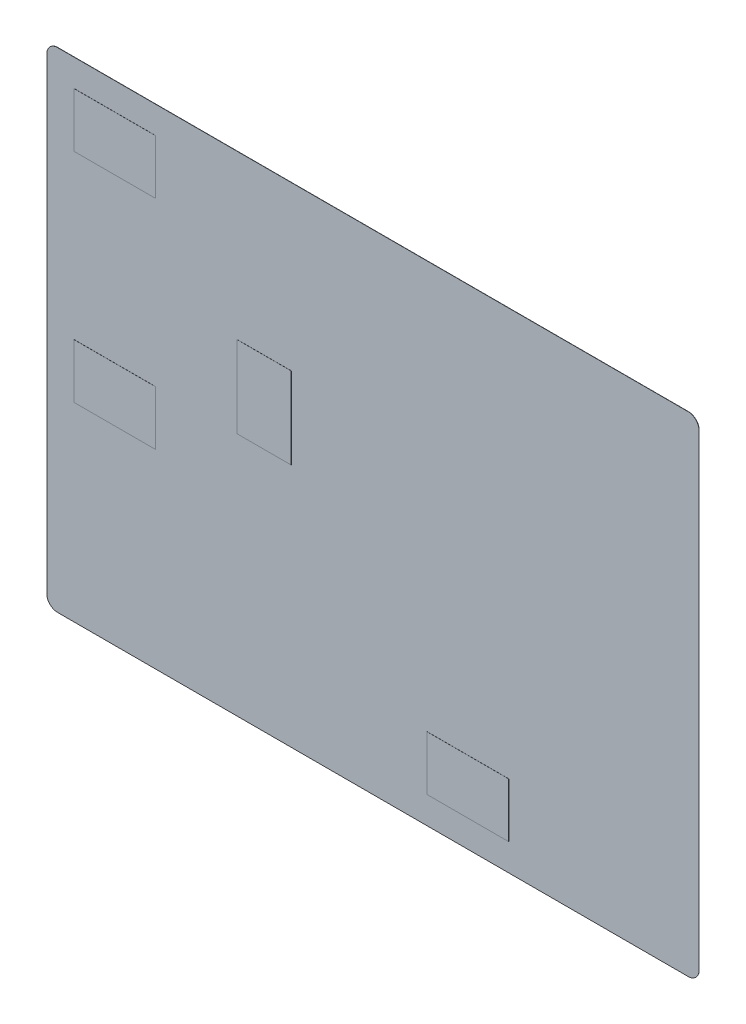
ISO-10303-21;
HEADER;
FILE_DESCRIPTION(('STEP AP214'),'2;1');
FILE_NAME('part.step','',(''),(''),'','','');
FILE_SCHEMA(('AUTOMOTIVE_DESIGN { 1 0 10303 214 1 1 1 1 }'));
ENDSEC;
DATA;
#1=APPLICATION_CONTEXT('core data for automotive mechanical design processes');
#2=APPLICATION_PROTOCOL_DEFINITION('international standard','automotive_design',2000,#1);
#3=PRODUCT_CONTEXT('',#1,'mechanical');
#4=PRODUCT('Part','Part','',(#3));
#5=PRODUCT_RELATED_PRODUCT_CATEGORY('part','',(#4));
#6=PRODUCT_DEFINITION_FORMATION('','',#4);
#7=PRODUCT_DEFINITION_CONTEXT('part definition',#1,'design');
#8=PRODUCT_DEFINITION('design','',#6,#7);
#9=PRODUCT_DEFINITION_SHAPE('','',#8);
#10=(LENGTH_UNIT() NAMED_UNIT(*) SI_UNIT(.MILLI.,.METRE.));
#11=(NAMED_UNIT(*) PLANE_ANGLE_UNIT() SI_UNIT($,.RADIAN.));
#12=(NAMED_UNIT(*) SI_UNIT($,.STERADIAN.) SOLID_ANGLE_UNIT());
#13=UNCERTAINTY_MEASURE_WITH_UNIT(LENGTH_MEASURE(1.E-05),#10,'distance_accuracy_value','');
#14=(GEOMETRIC_REPRESENTATION_CONTEXT(3) GLOBAL_UNCERTAINTY_ASSIGNED_CONTEXT((#13)) GLOBAL_UNIT_ASSIGNED_CONTEXT((#10,
#11,#12)) REPRESENTATION_CONTEXT('',''));
#15=CARTESIAN_POINT('',(0.,0.,0.));
#16=DIRECTION('',(0.,0.,1.));
#17=DIRECTION('',(1.,0.,0.));
#18=AXIS2_PLACEMENT_3D('',#15,#16,#17);
#19=CARTESIAN_POINT('',(0.,0.,0.));
#20=DIRECTION('',(0.,0.,1.));
#21=DIRECTION('',(1.,0.,0.));
#22=AXIS2_PLACEMENT_3D('',#19,#20,#21);
#23=PLANE('',#22);
#24=DIRECTION('',(0.,-1.,0.));
#25=VECTOR('',#24,1.);
#26=CARTESIAN_POINT('',(-2000.,2000.,0.));
#27=LINE('',#26,#25);
#28=CARTESIAN_POINT('',(-2000.,2000.,0.));
#29=VERTEX_POINT('',#28);
#30=CARTESIAN_POINT('',(-2000.,1500.,0.));
#31=VERTEX_POINT('',#30);
#32=EDGE_CURVE('E129',#29,#31,#27,.T.);
#33=ORIENTED_EDGE('',*,*,#32,.F.);
#34=DIRECTION('',(-1.,0.,0.));
#35=VECTOR('',#34,1.);
#36=CARTESIAN_POINT('',(-1250.,2000.,0.));
#37=LINE('',#36,#35);
#38=CARTESIAN_POINT('',(-1250.,2000.,0.));
#39=VERTEX_POINT('',#38);
#40=EDGE_CURVE('E75',#39,#29,#37,.T.);
#41=ORIENTED_EDGE('',*,*,#40,.F.);
#42=DIRECTION('',(0.,1.,0.));
#43=VECTOR('',#42,1.);
#44=CARTESIAN_POINT('',(-1250.,1500.,0.));
#45=LINE('',#44,#43);
#46=CARTESIAN_POINT('',(-1250.,1500.,0.));
#47=VERTEX_POINT('',#46);
#48=EDGE_CURVE('E152',#47,#39,#45,.T.);
#49=ORIENTED_EDGE('',*,*,#48,.F.);
#50=DIRECTION('',(1.,0.,0.));
#51=VECTOR('',#50,1.);
#52=CARTESIAN_POINT('',(-2000.,1500.,0.));
#53=LINE('',#52,#51);
#54=EDGE_CURVE('E133',#31,#47,#53,.T.);
#55=ORIENTED_EDGE('',*,*,#54,.F.);
#56=EDGE_LOOP('',(#33,#41,#49,#55));
#57=FACE_BOUND('',#56,.T.);
#58=ADVANCED_FACE('F66',(#57),#23,.F.);
#59=CARTESIAN_POINT('',(0.,0.,1.));
#60=DIRECTION('',(0.,0.,1.));
#61=DIRECTION('',(1.,0.,0.));
#62=AXIS2_PLACEMENT_3D('',#59,#60,#61);
#63=PLANE('',#62);
#64=DIRECTION('',(0.,-1.,0.));
#65=VECTOR('',#64,1.);
#66=CARTESIAN_POINT('',(-2000.,2000.,1.));
#67=LINE('',#66,#65);
#68=CARTESIAN_POINT('',(-2000.,2000.,1.));
#69=VERTEX_POINT('',#68);
#70=CARTESIAN_POINT('',(-2000.,1500.,1.));
#71=VERTEX_POINT('',#70);
#72=EDGE_CURVE('E131',#69,#71,#67,.T.);
#73=ORIENTED_EDGE('',*,*,#72,.T.);
#74=DIRECTION('',(1.,0.,0.));
#75=VECTOR('',#74,1.);
#76=CARTESIAN_POINT('',(-2000.,1500.,1.));
#77=LINE('',#76,#75);
#78=CARTESIAN_POINT('',(-1250.,1500.,1.));
#79=VERTEX_POINT('',#78);
#80=EDGE_CURVE('E145',#71,#79,#77,.T.);
#81=ORIENTED_EDGE('',*,*,#80,.T.);
#82=DIRECTION('',(0.,1.,0.));
#83=VECTOR('',#82,1.);
#84=CARTESIAN_POINT('',(-1250.,1500.,1.));
#85=LINE('',#84,#83);
#86=CARTESIAN_POINT('',(-1250.,2000.,1.));
#87=VERTEX_POINT('',#86);
#88=EDGE_CURVE('E123',#79,#87,#85,.T.);
#89=ORIENTED_EDGE('',*,*,#88,.T.);
#90=DIRECTION('',(-1.,0.,0.));
#91=VECTOR('',#90,1.);
#92=CARTESIAN_POINT('',(-1250.,2000.,1.));
#93=LINE('',#92,#91);
#94=EDGE_CURVE('E12',#87,#69,#93,.T.);
#95=ORIENTED_EDGE('',*,*,#94,.T.);
#96=EDGE_LOOP('',(#73,#81,#89,#95));
#97=FACE_BOUND('',#96,.T.);
#98=ADVANCED_FACE('F68',(#97),#63,.T.);
#99=CARTESIAN_POINT('',(-1250.,2000.,1.));
#100=DIRECTION('',(0.,-1.,0.));
#101=DIRECTION('',(0.,0.,-1.));
#102=AXIS2_PLACEMENT_3D('',#99,#100,#101);
#103=PLANE('',#102);
#104=ORIENTED_EDGE('',*,*,#40,.T.);
#105=DIRECTION('',(0.,0.,-1.));
#106=VECTOR('',#105,1.);
#107=CARTESIAN_POINT('',(-2000.,2000.,1.));
#108=LINE('',#107,#106);
#109=EDGE_CURVE('E117',#69,#29,#108,.T.);
#110=ORIENTED_EDGE('',*,*,#109,.F.);
#111=ORIENTED_EDGE('',*,*,#94,.F.);
#112=DIRECTION('',(0.,0.,-1.));
#113=VECTOR('',#112,1.);
#114=CARTESIAN_POINT('',(-1250.,2000.,1.));
#115=LINE('',#114,#113);
#116=EDGE_CURVE('E120',#87,#39,#115,.T.);
#117=ORIENTED_EDGE('',*,*,#116,.T.);
#118=EDGE_LOOP('',(#104,#110,#111,#117));
#119=FACE_BOUND('',#118,.T.);
#120=ADVANCED_FACE('F116',(#119),#103,.F.);
#121=CARTESIAN_POINT('',(-1250.,1500.,1.));
#122=DIRECTION('',(-1.,0.,0.));
#123=DIRECTION('',(0.,1.,0.));
#124=AXIS2_PLACEMENT_3D('',#121,#122,#123);
#125=PLANE('',#124);
#126=ORIENTED_EDGE('',*,*,#48,.T.);
#127=ORIENTED_EDGE('',*,*,#116,.F.);
#128=ORIENTED_EDGE('',*,*,#88,.F.);
#129=DIRECTION('',(0.,0.,-1.));
#130=VECTOR('',#129,1.);
#131=CARTESIAN_POINT('',(-1250.,1500.,1.));
#132=LINE('',#131,#130);
#133=EDGE_CURVE('E156',#79,#47,#132,.T.);
#134=ORIENTED_EDGE('',*,*,#133,.T.);
#135=EDGE_LOOP('',(#126,#127,#128,#134));
#136=FACE_BOUND('',#135,.T.);
#137=ADVANCED_FACE('F167',(#136),#125,.F.);
#138=CARTESIAN_POINT('',(-2000.,1500.,1.));
#139=DIRECTION('',(0.,1.,0.));
#140=DIRECTION('',(1.,0.,0.));
#141=AXIS2_PLACEMENT_3D('',#138,#139,#140);
#142=PLANE('',#141);
#143=ORIENTED_EDGE('',*,*,#54,.T.);
#144=ORIENTED_EDGE('',*,*,#133,.F.);
#145=ORIENTED_EDGE('',*,*,#80,.F.);
#146=DIRECTION('',(0.,0.,-1.));
#147=VECTOR('',#146,1.);
#148=CARTESIAN_POINT('',(-2000.,1500.,1.));
#149=LINE('',#148,#147);
#150=EDGE_CURVE('E138',#71,#31,#149,.T.);
#151=ORIENTED_EDGE('',*,*,#150,.T.);
#152=EDGE_LOOP('',(#143,#144,#145,#151));
#153=FACE_BOUND('',#152,.T.);
#154=ADVANCED_FACE('F169',(#153),#142,.F.);
#155=CARTESIAN_POINT('',(-2000.,2000.,1.));
#156=DIRECTION('',(1.,0.,0.));
#157=DIRECTION('',(0.,1.,0.));
#158=AXIS2_PLACEMENT_3D('',#155,#156,#157);
#159=PLANE('',#158);
#160=ORIENTED_EDGE('',*,*,#32,.T.);
#161=ORIENTED_EDGE('',*,*,#150,.F.);
#162=ORIENTED_EDGE('',*,*,#72,.F.);
#163=ORIENTED_EDGE('',*,*,#109,.T.);
#164=EDGE_LOOP('',(#160,#161,#162,#163));
#165=FACE_BOUND('',#164,.T.);
#166=ADVANCED_FACE('F127',(#165),#159,.F.);
#167=CLOSED_SHELL('',(#58,#98,#120,#137,#154,#166));
#168=MANIFOLD_SOLID_BREP('B2',#167);
#169=CARTESIAN_POINT('',(0.,0.,0.));
#170=DIRECTION('',(0.,0.,1.));
#171=DIRECTION('',(1.,0.,0.));
#172=AXIS2_PLACEMENT_3D('',#169,#170,#171);
#173=PLANE('',#172);
#174=DIRECTION('',(0.,-1.,0.));
#175=VECTOR('',#174,1.);
#176=CARTESIAN_POINT('',(-2000.,0.,0.));
#177=LINE('',#176,#175);
#178=CARTESIAN_POINT('',(-2000.,0.,0.));
#179=VERTEX_POINT('',#178);
#180=CARTESIAN_POINT('',(-2000.,-500.,0.));
#181=VERTEX_POINT('',#180);
#182=EDGE_CURVE('E363',#179,#181,#177,.T.);
#183=ORIENTED_EDGE('',*,*,#182,.F.);
#184=DIRECTION('',(-1.,0.,0.));
#185=VECTOR('',#184,1.);
#186=CARTESIAN_POINT('',(-1250.,0.,0.));
#187=LINE('',#186,#185);
#188=CARTESIAN_POINT('',(-1250.,0.,0.));
#189=VERTEX_POINT('',#188);
#190=EDGE_CURVE('E290',#189,#179,#187,.T.);
#191=ORIENTED_EDGE('',*,*,#190,.F.);
#192=DIRECTION('',(0.,1.,0.));
#193=VECTOR('',#192,1.);
#194=CARTESIAN_POINT('',(-1250.,-500.,0.));
#195=LINE('',#194,#193);
#196=CARTESIAN_POINT('',(-1250.,-500.,0.));
#197=VERTEX_POINT('',#196);
#198=EDGE_CURVE('E337',#197,#189,#195,.T.);
#199=ORIENTED_EDGE('',*,*,#198,.F.);
#200=DIRECTION('',(1.,0.,0.));
#201=VECTOR('',#200,1.);
#202=CARTESIAN_POINT('',(-2000.,-500.,0.));
#203=LINE('',#202,#201);
#204=EDGE_CURVE('E341',#181,#197,#203,.T.);
#205=ORIENTED_EDGE('',*,*,#204,.F.);
#206=EDGE_LOOP('',(#183,#191,#199,#205));
#207=FACE_BOUND('',#206,.T.);
#208=ADVANCED_FACE('F280',(#207),#173,.F.);
#209=CARTESIAN_POINT('',(0.,0.,1.));
#210=DIRECTION('',(0.,0.,1.));
#211=DIRECTION('',(1.,0.,0.));
#212=AXIS2_PLACEMENT_3D('',#209,#210,#211);
#213=PLANE('',#212);
#214=DIRECTION('',(0.,-1.,0.));
#215=VECTOR('',#214,1.);
#216=CARTESIAN_POINT('',(-2000.,0.,1.));
#217=LINE('',#216,#215);
#218=CARTESIAN_POINT('',(-2000.,0.,1.));
#219=VERTEX_POINT('',#218);
#220=CARTESIAN_POINT('',(-2000.,-500.,1.));
#221=VERTEX_POINT('',#220);
#222=EDGE_CURVE('E332',#219,#221,#217,.T.);
#223=ORIENTED_EDGE('',*,*,#222,.T.);
#224=DIRECTION('',(1.,0.,0.));
#225=VECTOR('',#224,1.);
#226=CARTESIAN_POINT('',(-2000.,-500.,1.));
#227=LINE('',#226,#225);
#228=CARTESIAN_POINT('',(-1250.,-500.,1.));
#229=VERTEX_POINT('',#228);
#230=EDGE_CURVE('E328',#221,#229,#227,.T.);
#231=ORIENTED_EDGE('',*,*,#230,.T.);
#232=DIRECTION('',(0.,1.,0.));
#233=VECTOR('',#232,1.);
#234=CARTESIAN_POINT('',(-1250.,-500.,1.));
#235=LINE('',#234,#233);
#236=CARTESIAN_POINT('',(-1250.,0.,1.));
#237=VERTEX_POINT('',#236);
#238=EDGE_CURVE('E283',#229,#237,#235,.T.);
#239=ORIENTED_EDGE('',*,*,#238,.T.);
#240=DIRECTION('',(-1.,0.,0.));
#241=VECTOR('',#240,1.);
#242=CARTESIAN_POINT('',(-1250.,0.,1.));
#243=LINE('',#242,#241);
#244=EDGE_CURVE('E64',#237,#219,#243,.T.);
#245=ORIENTED_EDGE('',*,*,#244,.T.);
#246=EDGE_LOOP('',(#223,#231,#239,#245));
#247=FACE_BOUND('',#246,.T.);
#248=ADVANCED_FACE('F329',(#247),#213,.T.);
#249=CARTESIAN_POINT('',(-1250.,0.,1.));
#250=DIRECTION('',(0.,-1.,0.));
#251=DIRECTION('',(0.,0.,-1.));
#252=AXIS2_PLACEMENT_3D('',#249,#250,#251);
#253=PLANE('',#252);
#254=ORIENTED_EDGE('',*,*,#190,.T.);
#255=DIRECTION('',(0.,0.,-1.));
#256=VECTOR('',#255,1.);
#257=CARTESIAN_POINT('',(-2000.,0.,1.));
#258=LINE('',#257,#256);
#259=EDGE_CURVE('E346',#219,#179,#258,.T.);
#260=ORIENTED_EDGE('',*,*,#259,.F.);
#261=ORIENTED_EDGE('',*,*,#244,.F.);
#262=DIRECTION('',(0.,0.,-1.));
#263=VECTOR('',#262,1.);
#264=CARTESIAN_POINT('',(-1250.,0.,1.));
#265=LINE('',#264,#263);
#266=EDGE_CURVE('E323',#237,#189,#265,.T.);
#267=ORIENTED_EDGE('',*,*,#266,.T.);
#268=EDGE_LOOP('',(#254,#260,#261,#267));
#269=FACE_BOUND('',#268,.T.);
#270=ADVANCED_FACE('F354',(#269),#253,.F.);
#271=CARTESIAN_POINT('',(-1250.,-500.,1.));
#272=DIRECTION('',(-1.,0.,0.));
#273=DIRECTION('',(0.,0.,1.));
#274=AXIS2_PLACEMENT_3D('',#271,#272,#273);
#275=PLANE('',#274);
#276=ORIENTED_EDGE('',*,*,#198,.T.);
#277=ORIENTED_EDGE('',*,*,#266,.F.);
#278=ORIENTED_EDGE('',*,*,#238,.F.);
#279=DIRECTION('',(0.,0.,-1.));
#280=VECTOR('',#279,1.);
#281=CARTESIAN_POINT('',(-1250.,-500.,1.));
#282=LINE('',#281,#280);
#283=EDGE_CURVE('E321',#229,#197,#282,.T.);
#284=ORIENTED_EDGE('',*,*,#283,.T.);
#285=EDGE_LOOP('',(#276,#277,#278,#284));
#286=FACE_BOUND('',#285,.T.);
#287=ADVANCED_FACE('F319',(#286),#275,.F.);
#288=CARTESIAN_POINT('',(-2000.,-500.,1.));
#289=DIRECTION('',(0.,1.,0.));
#290=DIRECTION('',(1.,0.,0.));
#291=AXIS2_PLACEMENT_3D('',#288,#289,#290);
#292=PLANE('',#291);
#293=ORIENTED_EDGE('',*,*,#204,.T.);
#294=ORIENTED_EDGE('',*,*,#283,.F.);
#295=ORIENTED_EDGE('',*,*,#230,.F.);
#296=DIRECTION('',(0.,0.,-1.));
#297=VECTOR('',#296,1.);
#298=CARTESIAN_POINT('',(-2000.,-500.,1.));
#299=LINE('',#298,#297);
#300=EDGE_CURVE('E366',#221,#181,#299,.T.);
#301=ORIENTED_EDGE('',*,*,#300,.T.);
#302=EDGE_LOOP('',(#293,#294,#295,#301));
#303=FACE_BOUND('',#302,.T.);
#304=ADVANCED_FACE('F339',(#303),#292,.F.);
#305=CARTESIAN_POINT('',(-2000.,0.,1.));
#306=DIRECTION('',(1.,0.,0.));
#307=DIRECTION('',(0.,-1.,0.));
#308=AXIS2_PLACEMENT_3D('',#305,#306,#307);
#309=PLANE('',#308);
#310=ORIENTED_EDGE('',*,*,#182,.T.);
#311=ORIENTED_EDGE('',*,*,#300,.F.);
#312=ORIENTED_EDGE('',*,*,#222,.F.);
#313=ORIENTED_EDGE('',*,*,#259,.T.);
#314=EDGE_LOOP('',(#310,#311,#312,#313));
#315=FACE_BOUND('',#314,.T.);
#316=ADVANCED_FACE('F362',(#315),#309,.F.);
#317=CLOSED_SHELL('',(#208,#248,#270,#287,#304,#316));
#318=MANIFOLD_SOLID_BREP('B6',#317);
#319=CARTESIAN_POINT('',(0.,0.,0.));
#320=DIRECTION('',(0.,0.,1.));
#321=DIRECTION('',(1.,0.,0.));
#322=AXIS2_PLACEMENT_3D('',#319,#320,#321);
#323=PLANE('',#322);
#324=DIRECTION('',(0.,-1.,0.));
#325=VECTOR('',#324,1.);
#326=CARTESIAN_POINT('',(-500.,750.,0.));
#327=LINE('',#326,#325);
#328=CARTESIAN_POINT('',(-500.,750.,0.));
#329=VERTEX_POINT('',#328);
#330=CARTESIAN_POINT('',(-500.,-1.66533453693773E-12,0.));
#331=VERTEX_POINT('',#330);
#332=EDGE_CURVE('E568',#329,#331,#327,.T.);
#333=ORIENTED_EDGE('',*,*,#332,.F.);
#334=DIRECTION('',(-1.,0.,0.));
#335=VECTOR('',#334,1.);
#336=CARTESIAN_POINT('',(4.54747350886464E-13,750.,0.));
#337=LINE('',#336,#335);
#338=CARTESIAN_POINT('',(4.54747350886464E-13,750.,0.));
#339=VERTEX_POINT('',#338);
#340=EDGE_CURVE('E502',#339,#329,#337,.T.);
#341=ORIENTED_EDGE('',*,*,#340,.F.);
#342=DIRECTION('',(0.,1.,0.));
#343=VECTOR('',#342,1.);
#344=CARTESIAN_POINT('',(1.56319401867222E-12,-1.13686837721616E-12,0.));
#345=LINE('',#344,#343);
#346=CARTESIAN_POINT('',(1.55431223447522E-12,-1.08585914020123E-12,0.));
#347=VERTEX_POINT('',#346);
#348=EDGE_CURVE('E557',#347,#339,#345,.T.);
#349=ORIENTED_EDGE('',*,*,#348,.F.);
#350=DIRECTION('',(1.,0.,0.));
#351=VECTOR('',#350,1.);
#352=CARTESIAN_POINT('',(-500.,-1.67688085639384E-12,0.));
#353=LINE('',#352,#351);
#354=EDGE_CURVE('E578',#331,#347,#353,.T.);
#355=ORIENTED_EDGE('',*,*,#354,.F.);
#356=EDGE_LOOP('',(#333,#341,#349,#355));
#357=FACE_BOUND('',#356,.T.);
#358=ADVANCED_FACE('F494',(#357),#323,.F.);
#359=CARTESIAN_POINT('',(0.,0.,1.));
#360=DIRECTION('',(0.,0.,1.));
#361=DIRECTION('',(1.,0.,0.));
#362=AXIS2_PLACEMENT_3D('',#359,#360,#361);
#363=PLANE('',#362);
#364=DIRECTION('',(0.,-1.,0.));
#365=VECTOR('',#364,1.);
#366=CARTESIAN_POINT('',(-500.,750.,1.));
#367=LINE('',#366,#365);
#368=CARTESIAN_POINT('',(-500.,750.,1.));
#369=VERTEX_POINT('',#368);
#370=CARTESIAN_POINT('',(-500.,-1.66533453693773E-12,1.));
#371=VERTEX_POINT('',#370);
#372=EDGE_CURVE('E560',#369,#371,#367,.T.);
#373=ORIENTED_EDGE('',*,*,#372,.T.);
#374=DIRECTION('',(1.,0.,0.));
#375=VECTOR('',#374,1.);
#376=CARTESIAN_POINT('',(-500.,-1.67688085639384E-12,1.));
#377=LINE('',#376,#375);
#378=CARTESIAN_POINT('',(1.55431223447522E-12,-1.08585914020123E-12,1.));
#379=VERTEX_POINT('',#378);
#380=EDGE_CURVE('E546',#371,#379,#377,.T.);
#381=ORIENTED_EDGE('',*,*,#380,.T.);
#382=DIRECTION('',(0.,1.,0.));
#383=VECTOR('',#382,1.);
#384=CARTESIAN_POINT('',(1.56319401867222E-12,-1.13686837721616E-12,1.));
#385=LINE('',#384,#383);
#386=CARTESIAN_POINT('',(4.54747350886464E-13,750.,1.));
#387=VERTEX_POINT('',#386);
#388=EDGE_CURVE('E587',#379,#387,#385,.T.);
#389=ORIENTED_EDGE('',*,*,#388,.T.);
#390=DIRECTION('',(-1.,0.,0.));
#391=VECTOR('',#390,1.);
#392=CARTESIAN_POINT('',(4.54747350886464E-13,750.,1.));
#393=LINE('',#392,#391);
#394=EDGE_CURVE('E278',#387,#369,#393,.T.);
#395=ORIENTED_EDGE('',*,*,#394,.T.);
#396=EDGE_LOOP('',(#373,#381,#389,#395));
#397=FACE_BOUND('',#396,.T.);
#398=ADVANCED_FACE('F561',(#397),#363,.T.);
#399=CARTESIAN_POINT('',(4.54747350886464E-13,750.,1.));
#400=DIRECTION('',(0.,-1.,0.));
#401=DIRECTION('',(-1.,0.,0.));
#402=AXIS2_PLACEMENT_3D('',#399,#400,#401);
#403=PLANE('',#402);
#404=ORIENTED_EDGE('',*,*,#340,.T.);
#405=DIRECTION('',(0.,0.,-1.));
#406=VECTOR('',#405,1.);
#407=CARTESIAN_POINT('',(-500.,750.,1.));
#408=LINE('',#407,#406);
#409=EDGE_CURVE('E565',#369,#329,#408,.T.);
#410=ORIENTED_EDGE('',*,*,#409,.F.);
#411=ORIENTED_EDGE('',*,*,#394,.F.);
#412=DIRECTION('',(0.,0.,-1.));
#413=VECTOR('',#412,1.);
#414=CARTESIAN_POINT('',(4.54747350886464E-13,750.,1.));
#415=LINE('',#414,#413);
#416=EDGE_CURVE('E585',#387,#339,#415,.T.);
#417=ORIENTED_EDGE('',*,*,#416,.T.);
#418=EDGE_LOOP('',(#404,#410,#411,#417));
#419=FACE_BOUND('',#418,.T.);
#420=ADVANCED_FACE('F595',(#419),#403,.F.);
#421=CARTESIAN_POINT('',(1.56319401867222E-12,-1.13686837721616E-12,1.));
#422=DIRECTION('',(-1.,0.,0.));
#423=DIRECTION('',(0.,1.,0.));
#424=AXIS2_PLACEMENT_3D('',#421,#422,#423);
#425=PLANE('',#424);
#426=ORIENTED_EDGE('',*,*,#348,.T.);
#427=ORIENTED_EDGE('',*,*,#416,.F.);
#428=ORIENTED_EDGE('',*,*,#388,.F.);
#429=DIRECTION('',(0.,0.,-1.));
#430=VECTOR('',#429,1.);
#431=CARTESIAN_POINT('',(1.55431223447522E-12,-1.08585914020123E-12,1.));
#432=LINE('',#431,#430);
#433=EDGE_CURVE('E554',#379,#347,#432,.T.);
#434=ORIENTED_EDGE('',*,*,#433,.T.);
#435=EDGE_LOOP('',(#426,#427,#428,#434));
#436=FACE_BOUND('',#435,.T.);
#437=ADVANCED_FACE('F597',(#436),#425,.F.);
#438=CARTESIAN_POINT('',(-500.,-1.67688085639384E-12,1.));
#439=DIRECTION('',(0.,1.,0.));
#440=DIRECTION('',(1.,0.,0.));
#441=AXIS2_PLACEMENT_3D('',#438,#439,#440);
#442=PLANE('',#441);
#443=ORIENTED_EDGE('',*,*,#354,.T.);
#444=ORIENTED_EDGE('',*,*,#433,.F.);
#445=ORIENTED_EDGE('',*,*,#380,.F.);
#446=DIRECTION('',(0.,0.,-1.));
#447=VECTOR('',#446,1.);
#448=CARTESIAN_POINT('',(-500.,-1.66533453693773E-12,1.));
#449=LINE('',#448,#447);
#450=EDGE_CURVE('E551',#371,#331,#449,.T.);
#451=ORIENTED_EDGE('',*,*,#450,.T.);
#452=EDGE_LOOP('',(#443,#444,#445,#451));
#453=FACE_BOUND('',#452,.T.);
#454=ADVANCED_FACE('F549',(#453),#442,.F.);
#455=CARTESIAN_POINT('',(-500.,750.,1.));
#456=DIRECTION('',(1.,0.,0.));
#457=DIRECTION('',(0.,1.,0.));
#458=AXIS2_PLACEMENT_3D('',#455,#456,#457);
#459=PLANE('',#458);
#460=ORIENTED_EDGE('',*,*,#332,.T.);
#461=ORIENTED_EDGE('',*,*,#450,.F.);
#462=ORIENTED_EDGE('',*,*,#372,.F.);
#463=ORIENTED_EDGE('',*,*,#409,.T.);
#464=EDGE_LOOP('',(#460,#461,#462,#463));
#465=FACE_BOUND('',#464,.T.);
#466=ADVANCED_FACE('F567',(#465),#459,.F.);
#467=CLOSED_SHELL('',(#358,#398,#420,#437,#454,#466));
#468=MANIFOLD_SOLID_BREP('B58',#467);
#469=CARTESIAN_POINT('',(0.,0.,0.));
#470=DIRECTION('',(0.,0.,1.));
#471=DIRECTION('',(1.,0.,0.));
#472=AXIS2_PLACEMENT_3D('',#469,#470,#471);
#473=PLANE('',#472);
#474=DIRECTION('',(0.,1.,0.));
#475=VECTOR('',#474,1.);
#476=CARTESIAN_POINT('',(2000.,-2000.,0.));
#477=LINE('',#476,#475);
#478=CARTESIAN_POINT('',(2000.,-2000.,0.));
#479=VERTEX_POINT('',#478);
#480=CARTESIAN_POINT('',(2000.,-1500.,0.));
#481=VERTEX_POINT('',#480);
#482=EDGE_CURVE('E798',#479,#481,#477,.T.);
#483=ORIENTED_EDGE('',*,*,#482,.F.);
#484=DIRECTION('',(1.,0.,0.));
#485=VECTOR('',#484,1.);
#486=CARTESIAN_POINT('',(1250.,-2000.,0.));
#487=LINE('',#486,#485);
#488=CARTESIAN_POINT('',(1250.,-2000.,0.));
#489=VERTEX_POINT('',#488);
#490=EDGE_CURVE('E716',#489,#479,#487,.T.);
#491=ORIENTED_EDGE('',*,*,#490,.F.);
#492=DIRECTION('',(0.,-1.,0.));
#493=VECTOR('',#492,1.);
#494=CARTESIAN_POINT('',(1250.,-1500.,0.));
#495=LINE('',#494,#493);
#496=CARTESIAN_POINT('',(1250.,-1500.,0.));
#497=VERTEX_POINT('',#496);
#498=EDGE_CURVE('E775',#497,#489,#495,.T.);
#499=ORIENTED_EDGE('',*,*,#498,.F.);
#500=DIRECTION('',(-1.,0.,0.));
#501=VECTOR('',#500,1.);
#502=CARTESIAN_POINT('',(2000.,-1500.,0.));
#503=LINE('',#502,#501);
#504=EDGE_CURVE('E778',#481,#497,#503,.T.);
#505=ORIENTED_EDGE('',*,*,#504,.F.);
#506=EDGE_LOOP('',(#483,#491,#499,#505));
#507=FACE_BOUND('',#506,.T.);
#508=ADVANCED_FACE('F707',(#507),#473,.F.);
#509=CARTESIAN_POINT('',(0.,0.,1.));
#510=DIRECTION('',(0.,0.,1.));
#511=DIRECTION('',(1.,0.,0.));
#512=AXIS2_PLACEMENT_3D('',#509,#510,#511);
#513=PLANE('',#512);
#514=DIRECTION('',(0.,1.,0.));
#515=VECTOR('',#514,1.);
#516=CARTESIAN_POINT('',(2000.,-2000.,1.));
#517=LINE('',#516,#515);
#518=CARTESIAN_POINT('',(2000.,-2000.,1.));
#519=VERTEX_POINT('',#518);
#520=CARTESIAN_POINT('',(2000.,-1500.,1.));
#521=VERTEX_POINT('',#520);
#522=EDGE_CURVE('E772',#519,#521,#517,.T.);
#523=ORIENTED_EDGE('',*,*,#522,.T.);
#524=DIRECTION('',(-1.,0.,0.));
#525=VECTOR('',#524,1.);
#526=CARTESIAN_POINT('',(2000.,-1500.,1.));
#527=LINE('',#526,#525);
#528=CARTESIAN_POINT('',(1250.,-1500.,1.));
#529=VERTEX_POINT('',#528);
#530=EDGE_CURVE('E750',#521,#529,#527,.T.);
#531=ORIENTED_EDGE('',*,*,#530,.T.);
#532=DIRECTION('',(0.,-1.,0.));
#533=VECTOR('',#532,1.);
#534=CARTESIAN_POINT('',(1250.,-1500.,1.));
#535=LINE('',#534,#533);
#536=CARTESIAN_POINT('',(1250.,-2000.,1.));
#537=VERTEX_POINT('',#536);
#538=EDGE_CURVE('E763',#529,#537,#535,.T.);
#539=ORIENTED_EDGE('',*,*,#538,.T.);
#540=DIRECTION('',(1.,0.,0.));
#541=VECTOR('',#540,1.);
#542=CARTESIAN_POINT('',(1250.,-2000.,1.));
#543=LINE('',#542,#541);
#544=EDGE_CURVE('E492',#537,#519,#543,.T.);
#545=ORIENTED_EDGE('',*,*,#544,.T.);
#546=EDGE_LOOP('',(#523,#531,#539,#545));
#547=FACE_BOUND('',#546,.T.);
#548=ADVANCED_FACE('F770',(#547),#513,.T.);
#549=CARTESIAN_POINT('',(1250.,-2000.,1.));
#550=DIRECTION('',(0.,1.,0.));
#551=DIRECTION('',(1.,0.,0.));
#552=AXIS2_PLACEMENT_3D('',#549,#550,#551);
#553=PLANE('',#552);
#554=ORIENTED_EDGE('',*,*,#490,.T.);
#555=DIRECTION('',(0.,0.,-1.));
#556=VECTOR('',#555,1.);
#557=CARTESIAN_POINT('',(2000.,-2000.,1.));
#558=LINE('',#557,#556);
#559=EDGE_CURVE('E784',#519,#479,#558,.T.);
#560=ORIENTED_EDGE('',*,*,#559,.F.);
#561=ORIENTED_EDGE('',*,*,#544,.F.);
#562=DIRECTION('',(0.,0.,-1.));
#563=VECTOR('',#562,1.);
#564=CARTESIAN_POINT('',(1250.,-2000.,1.));
#565=LINE('',#564,#563);
#566=EDGE_CURVE('E768',#537,#489,#565,.T.);
#567=ORIENTED_EDGE('',*,*,#566,.T.);
#568=EDGE_LOOP('',(#554,#560,#561,#567));
#569=FACE_BOUND('',#568,.T.);
#570=ADVANCED_FACE('F792',(#569),#553,.F.);
#571=CARTESIAN_POINT('',(1250.,-1500.,1.));
#572=DIRECTION('',(1.,0.,0.));
#573=DIRECTION('',(0.,-1.,0.));
#574=AXIS2_PLACEMENT_3D('',#571,#572,#573);
#575=PLANE('',#574);
#576=ORIENTED_EDGE('',*,*,#498,.T.);
#577=ORIENTED_EDGE('',*,*,#566,.F.);
#578=ORIENTED_EDGE('',*,*,#538,.F.);
#579=DIRECTION('',(0.,0.,-1.));
#580=VECTOR('',#579,1.);
#581=CARTESIAN_POINT('',(1250.,-1500.,1.));
#582=LINE('',#581,#580);
#583=EDGE_CURVE('E766',#529,#497,#582,.T.);
#584=ORIENTED_EDGE('',*,*,#583,.T.);
#585=EDGE_LOOP('',(#576,#577,#578,#584));
#586=FACE_BOUND('',#585,.T.);
#587=ADVANCED_FACE('F765',(#586),#575,.F.);
#588=CARTESIAN_POINT('',(2000.,-1500.,1.));
#589=DIRECTION('',(0.,-1.,0.));
#590=DIRECTION('',(-1.,0.,0.));
#591=AXIS2_PLACEMENT_3D('',#588,#589,#590);
#592=PLANE('',#591);
#593=ORIENTED_EDGE('',*,*,#504,.T.);
#594=ORIENTED_EDGE('',*,*,#583,.F.);
#595=ORIENTED_EDGE('',*,*,#530,.F.);
#596=DIRECTION('',(0.,0.,-1.));
#597=VECTOR('',#596,1.);
#598=CARTESIAN_POINT('',(2000.,-1500.,1.));
#599=LINE('',#598,#597);
#600=EDGE_CURVE('E802',#521,#481,#599,.T.);
#601=ORIENTED_EDGE('',*,*,#600,.T.);
#602=EDGE_LOOP('',(#593,#594,#595,#601));
#603=FACE_BOUND('',#602,.T.);
#604=ADVANCED_FACE('F777',(#603),#592,.F.);
#605=CARTESIAN_POINT('',(2000.,-2000.,1.));
#606=DIRECTION('',(-1.,0.,0.));
#607=DIRECTION('',(0.,0.,1.));
#608=AXIS2_PLACEMENT_3D('',#605,#606,#607);
#609=PLANE('',#608);
#610=ORIENTED_EDGE('',*,*,#482,.T.);
#611=ORIENTED_EDGE('',*,*,#600,.F.);
#612=ORIENTED_EDGE('',*,*,#522,.F.);
#613=ORIENTED_EDGE('',*,*,#559,.T.);
#614=EDGE_LOOP('',(#610,#611,#612,#613));
#615=FACE_BOUND('',#614,.T.);
#616=ADVANCED_FACE('F797',(#615),#609,.F.);
#617=CLOSED_SHELL('',(#508,#548,#570,#587,#604,#616));
#618=MANIFOLD_SOLID_BREP('B272',#617);
#619=CARTESIAN_POINT('',(-2150.,-2150.,-2.));
#620=DIRECTION('',(0.,0.,1.));
#621=DIRECTION('',(1.,0.,0.));
#622=AXIS2_PLACEMENT_3D('',#619,#620,#621);
#623=CYLINDRICAL_SURFACE('',#622,100.);
#624=CARTESIAN_POINT('',(-2150.,-2150.,-2.));
#625=DIRECTION('',(0.,0.,-1.));
#626=DIRECTION('',(1.,0.,0.));
#627=AXIS2_PLACEMENT_3D('',#624,#625,#626);
#628=CIRCLE('',#627,100.);
#629=CARTESIAN_POINT('',(-2150.,-2250.,-2.));
#630=VERTEX_POINT('',#629);
#631=CARTESIAN_POINT('',(-2250.,-2150.,-2.));
#632=VERTEX_POINT('',#631);
#633=EDGE_CURVE('E932',#630,#632,#628,.T.);
#634=ORIENTED_EDGE('',*,*,#633,.F.);
#635=DIRECTION('',(0.,0.,-1.));
#636=VECTOR('',#635,1.);
#637=CARTESIAN_POINT('',(-2150.,-2250.,-2.));
#638=LINE('',#637,#636);
#639=CARTESIAN_POINT('',(-2150.,-2250.,0.));
#640=VERTEX_POINT('',#639);
#641=EDGE_CURVE('E999',#640,#630,#638,.T.);
#642=ORIENTED_EDGE('',*,*,#641,.F.);
#643=CARTESIAN_POINT('',(-2150.,-2150.,0.));
#644=DIRECTION('',(0.,0.,1.));
#645=DIRECTION('',(1.,0.,0.));
#646=AXIS2_PLACEMENT_3D('',#643,#644,#645);
#647=CIRCLE('',#646,100.);
#648=CARTESIAN_POINT('',(-2250.,-2150.,0.));
#649=VERTEX_POINT('',#648);
#650=EDGE_CURVE('E914',#649,#640,#647,.T.);
#651=ORIENTED_EDGE('',*,*,#650,.F.);
#652=DIRECTION('',(0.,0.,1.));
#653=VECTOR('',#652,1.);
#654=CARTESIAN_POINT('',(-2250.,-2150.,-2.));
#655=LINE('',#654,#653);
#656=EDGE_CURVE('E1002',#632,#649,#655,.T.);
#657=ORIENTED_EDGE('',*,*,#656,.F.);
#658=EDGE_LOOP('',(#634,#642,#651,#657));
#659=FACE_BOUND('',#658,.T.);
#660=ADVANCED_FACE('F911',(#659),#623,.T.);
#661=CARTESIAN_POINT('',(3650.,-2150.,-2.));
#662=DIRECTION('',(0.,0.,1.));
#663=DIRECTION('',(1.,0.,0.));
#664=AXIS2_PLACEMENT_3D('',#661,#662,#663);
#665=CYLINDRICAL_SURFACE('',#664,100.);
#666=CARTESIAN_POINT('',(3650.,-2150.,-2.));
#667=DIRECTION('',(0.,0.,-1.));
#668=DIRECTION('',(1.,0.,0.));
#669=AXIS2_PLACEMENT_3D('',#666,#667,#668);
#670=CIRCLE('',#669,100.);
#671=CARTESIAN_POINT('',(3750.,-2150.,-2.));
#672=VERTEX_POINT('',#671);
#673=CARTESIAN_POINT('',(3650.,-2250.,-2.));
#674=VERTEX_POINT('',#673);
#675=EDGE_CURVE('E1006',#672,#674,#670,.T.);
#676=ORIENTED_EDGE('',*,*,#675,.F.);
#677=DIRECTION('',(0.,0.,-1.));
#678=VECTOR('',#677,1.);
#679=CARTESIAN_POINT('',(3750.,-2150.,-2.));
#680=LINE('',#679,#678);
#681=CARTESIAN_POINT('',(3750.,-2150.,0.));
#682=VERTEX_POINT('',#681);
#683=EDGE_CURVE('E1053',#682,#672,#680,.T.);
#684=ORIENTED_EDGE('',*,*,#683,.F.);
#685=CARTESIAN_POINT('',(3650.,-2150.,0.));
#686=DIRECTION('',(0.,0.,1.));
#687=DIRECTION('',(1.,0.,0.));
#688=AXIS2_PLACEMENT_3D('',#685,#686,#687);
#689=CIRCLE('',#688,100.);
#690=CARTESIAN_POINT('',(3650.,-2250.,0.));
#691=VERTEX_POINT('',#690);
#692=EDGE_CURVE('E920',#691,#682,#689,.T.);
#693=ORIENTED_EDGE('',*,*,#692,.F.);
#694=DIRECTION('',(0.,0.,1.));
#695=VECTOR('',#694,1.);
#696=CARTESIAN_POINT('',(3650.,-2250.,-2.));
#697=LINE('',#696,#695);
#698=EDGE_CURVE('E1022',#674,#691,#697,.T.);
#699=ORIENTED_EDGE('',*,*,#698,.F.);
#700=EDGE_LOOP('',(#676,#684,#693,#699));
#701=FACE_BOUND('',#700,.T.);
#702=ADVANCED_FACE('F1106',(#701),#665,.T.);
#703=CARTESIAN_POINT('',(3650.,2150.,-2.));
#704=DIRECTION('',(0.,0.,1.));
#705=DIRECTION('',(1.,0.,0.));
#706=AXIS2_PLACEMENT_3D('',#703,#704,#705);
#707=CYLINDRICAL_SURFACE('',#706,100.);
#708=CARTESIAN_POINT('',(3650.,2150.,-2.));
#709=DIRECTION('',(0.,0.,-1.));
#710=DIRECTION('',(1.,0.,0.));
#711=AXIS2_PLACEMENT_3D('',#708,#709,#710);
#712=CIRCLE('',#711,100.);
#713=CARTESIAN_POINT('',(3650.,2250.,-2.));
#714=VERTEX_POINT('',#713);
#715=CARTESIAN_POINT('',(3750.,2150.,-2.));
#716=VERTEX_POINT('',#715);
#717=EDGE_CURVE('E1078',#714,#716,#712,.T.);
#718=ORIENTED_EDGE('',*,*,#717,.F.);
#719=DIRECTION('',(0.,0.,-1.));
#720=VECTOR('',#719,1.);
#721=CARTESIAN_POINT('',(3650.,2250.,-2.));
#722=LINE('',#721,#720);
#723=CARTESIAN_POINT('',(3650.,2250.,0.));
#724=VERTEX_POINT('',#723);
#725=EDGE_CURVE('E1069',#724,#714,#722,.T.);
#726=ORIENTED_EDGE('',*,*,#725,.F.);
#727=CARTESIAN_POINT('',(3650.,2150.,0.));
#728=DIRECTION('',(0.,0.,1.));
#729=DIRECTION('',(1.,0.,0.));
#730=AXIS2_PLACEMENT_3D('',#727,#728,#729);
#731=CIRCLE('',#730,100.);
#732=CARTESIAN_POINT('',(3750.,2150.,0.));
#733=VERTEX_POINT('',#732);
#734=EDGE_CURVE('E705',#733,#724,#731,.T.);
#735=ORIENTED_EDGE('',*,*,#734,.F.);
#736=DIRECTION('',(0.,0.,1.));
#737=VECTOR('',#736,1.);
#738=CARTESIAN_POINT('',(3750.,2150.,-2.));
#739=LINE('',#738,#737);
#740=EDGE_CURVE('E1042',#716,#733,#739,.T.);
#741=ORIENTED_EDGE('',*,*,#740,.F.);
#742=EDGE_LOOP('',(#718,#726,#735,#741));
#743=FACE_BOUND('',#742,.T.);
#744=ADVANCED_FACE('F1099',(#743),#707,.T.);
#745=CARTESIAN_POINT('',(-2150.,2150.,-2.));
#746=DIRECTION('',(0.,0.,1.));
#747=DIRECTION('',(1.,0.,0.));
#748=AXIS2_PLACEMENT_3D('',#745,#746,#747);
#749=CYLINDRICAL_SURFACE('',#748,100.);
#750=CARTESIAN_POINT('',(-2150.,2150.,-2.));
#751=DIRECTION('',(0.,0.,-1.));
#752=DIRECTION('',(1.,0.,0.));
#753=AXIS2_PLACEMENT_3D('',#750,#751,#752);
#754=CIRCLE('',#753,100.);
#755=CARTESIAN_POINT('',(-2250.,2150.,-2.));
#756=VERTEX_POINT('',#755);
#757=CARTESIAN_POINT('',(-2150.,2250.,-2.));
#758=VERTEX_POINT('',#757);
#759=EDGE_CURVE('E942',#756,#758,#754,.T.);
#760=ORIENTED_EDGE('',*,*,#759,.F.);
#761=DIRECTION('',(0.,0.,-1.));
#762=VECTOR('',#761,1.);
#763=CARTESIAN_POINT('',(-2250.,2150.,-2.));
#764=LINE('',#763,#762);
#765=CARTESIAN_POINT('',(-2250.,2150.,0.));
#766=VERTEX_POINT('',#765);
#767=EDGE_CURVE('E1030',#766,#756,#764,.T.);
#768=ORIENTED_EDGE('',*,*,#767,.F.);
#769=CARTESIAN_POINT('',(-2150.,2150.,0.));
#770=DIRECTION('',(0.,0.,1.));
#771=DIRECTION('',(1.,0.,0.));
#772=AXIS2_PLACEMENT_3D('',#769,#770,#771);
#773=CIRCLE('',#772,100.);
#774=CARTESIAN_POINT('',(-2150.,2250.,0.));
#775=VERTEX_POINT('',#774);
#776=EDGE_CURVE('E1005',#775,#766,#773,.T.);
#777=ORIENTED_EDGE('',*,*,#776,.F.);
#778=DIRECTION('',(0.,0.,1.));
#779=VECTOR('',#778,1.);
#780=CARTESIAN_POINT('',(-2150.,2250.,-2.));
#781=LINE('',#780,#779);
#782=EDGE_CURVE('E1058',#758,#775,#781,.T.);
#783=ORIENTED_EDGE('',*,*,#782,.F.);
#784=EDGE_LOOP('',(#760,#768,#777,#783));
#785=FACE_BOUND('',#784,.T.);
#786=ADVANCED_FACE('F1093',(#785),#749,.T.);
#787=CARTESIAN_POINT('',(0.,0.,0.));
#788=DIRECTION('',(0.,0.,1.));
#789=DIRECTION('',(1.,0.,0.));
#790=AXIS2_PLACEMENT_3D('',#787,#788,#789);
#791=PLANE('',#790);
#792=DIRECTION('',(-1.,0.,0.));
#793=VECTOR('',#792,1.);
#794=CARTESIAN_POINT('',(0.,2250.,0.));
#795=LINE('',#794,#793);
#796=EDGE_CURVE('E1065',#724,#775,#795,.T.);
#797=ORIENTED_EDGE('',*,*,#796,.T.);
#798=ORIENTED_EDGE('',*,*,#776,.T.);
#799=DIRECTION('',(0.,-1.,0.));
#800=VECTOR('',#799,1.);
#801=CARTESIAN_POINT('',(-2250.,2250.,0.));
#802=LINE('',#801,#800);
#803=EDGE_CURVE('E1041',#766,#649,#802,.T.);
#804=ORIENTED_EDGE('',*,*,#803,.T.);
#805=ORIENTED_EDGE('',*,*,#650,.T.);
#806=DIRECTION('',(1.,0.,0.));
#807=VECTOR('',#806,1.);
#808=CARTESIAN_POINT('',(0.,-2250.,0.));
#809=LINE('',#808,#807);
#810=EDGE_CURVE('E1014',#640,#691,#809,.T.);
#811=ORIENTED_EDGE('',*,*,#810,.T.);
#812=ORIENTED_EDGE('',*,*,#692,.T.);
#813=DIRECTION('',(0.,1.,0.));
#814=VECTOR('',#813,1.);
#815=CARTESIAN_POINT('',(3750.,-7.40148683083438E-13,0.));
#816=LINE('',#815,#814);
#817=EDGE_CURVE('E1046',#682,#733,#816,.T.);
#818=ORIENTED_EDGE('',*,*,#817,.T.);
#819=ORIENTED_EDGE('',*,*,#734,.T.);
#820=EDGE_LOOP('',(#797,#798,#804,#805,#811,#812,#818,#819));
#821=FACE_BOUND('',#820,.T.);
#822=ADVANCED_FACE('F1088',(#821),#791,.T.);
#823=CARTESIAN_POINT('',(0.,0.,-2.));
#824=DIRECTION('',(0.,0.,1.));
#825=DIRECTION('',(1.,0.,0.));
#826=AXIS2_PLACEMENT_3D('',#823,#824,#825);
#827=PLANE('',#826);
#828=DIRECTION('',(0.,-1.,0.));
#829=VECTOR('',#828,1.);
#830=CARTESIAN_POINT('',(-2250.,-4.54747350886464E-13,-2.));
#831=LINE('',#830,#829);
#832=EDGE_CURVE('E1028',#756,#632,#831,.T.);
#833=ORIENTED_EDGE('',*,*,#832,.F.);
#834=ORIENTED_EDGE('',*,*,#759,.T.);
#835=DIRECTION('',(-1.,0.,0.));
#836=VECTOR('',#835,1.);
#837=CARTESIAN_POINT('',(2250.,2250.,-2.));
#838=LINE('',#837,#836);
#839=EDGE_CURVE('E1054',#714,#758,#838,.T.);
#840=ORIENTED_EDGE('',*,*,#839,.F.);
#841=ORIENTED_EDGE('',*,*,#717,.T.);
#842=DIRECTION('',(0.,1.,0.));
#843=VECTOR('',#842,1.);
#844=CARTESIAN_POINT('',(3750.,-7.40148683083438E-13,-2.));
#845=LINE('',#844,#843);
#846=EDGE_CURVE('E1016',#672,#716,#845,.T.);
#847=ORIENTED_EDGE('',*,*,#846,.F.);
#848=ORIENTED_EDGE('',*,*,#675,.T.);
#849=DIRECTION('',(1.,0.,0.));
#850=VECTOR('',#849,1.);
#851=CARTESIAN_POINT('',(-2250.,-2250.,-2.));
#852=LINE('',#851,#850);
#853=EDGE_CURVE('E1012',#630,#674,#852,.T.);
#854=ORIENTED_EDGE('',*,*,#853,.F.);
#855=ORIENTED_EDGE('',*,*,#633,.T.);
#856=EDGE_LOOP('',(#833,#834,#840,#841,#847,#848,#854,#855));
#857=FACE_BOUND('',#856,.T.);
#858=ADVANCED_FACE('F1018',(#857),#827,.F.);
#859=CARTESIAN_POINT('',(-2250.,2250.,-2.));
#860=DIRECTION('',(-1.,0.,0.));
#861=DIRECTION('',(0.,1.,0.));
#862=AXIS2_PLACEMENT_3D('',#859,#860,#861);
#863=PLANE('',#862);
#864=ORIENTED_EDGE('',*,*,#803,.F.);
#865=ORIENTED_EDGE('',*,*,#767,.T.);
#866=ORIENTED_EDGE('',*,*,#832,.T.);
#867=ORIENTED_EDGE('',*,*,#656,.T.);
#868=EDGE_LOOP('',(#864,#865,#866,#867));
#869=FACE_BOUND('',#868,.T.);
#870=ADVANCED_FACE('F1091',(#869),#863,.T.);
#871=CARTESIAN_POINT('',(0.,2250.,-2.));
#872=DIRECTION('',(0.,1.,0.));
#873=DIRECTION('',(1.,0.,0.));
#874=AXIS2_PLACEMENT_3D('',#871,#872,#873);
#875=PLANE('',#874);
#876=ORIENTED_EDGE('',*,*,#839,.T.);
#877=ORIENTED_EDGE('',*,*,#782,.T.);
#878=ORIENTED_EDGE('',*,*,#796,.F.);
#879=ORIENTED_EDGE('',*,*,#725,.T.);
#880=EDGE_LOOP('',(#876,#877,#878,#879));
#881=FACE_BOUND('',#880,.T.);
#882=ADVANCED_FACE('F1096',(#881),#875,.T.);
#883=CARTESIAN_POINT('',(3750.,-2.96059473233375E-13,-2.));
#884=DIRECTION('',(1.,0.,0.));
#885=DIRECTION('',(0.,-1.,0.));
#886=AXIS2_PLACEMENT_3D('',#883,#884,#885);
#887=PLANE('',#886);
#888=ORIENTED_EDGE('',*,*,#846,.T.);
#889=ORIENTED_EDGE('',*,*,#740,.T.);
#890=ORIENTED_EDGE('',*,*,#817,.F.);
#891=ORIENTED_EDGE('',*,*,#683,.T.);
#892=EDGE_LOOP('',(#888,#889,#890,#891));
#893=FACE_BOUND('',#892,.T.);
#894=ADVANCED_FACE('F1102',(#893),#887,.T.);
#895=CARTESIAN_POINT('',(0.,-2250.,-2.));
#896=DIRECTION('',(0.,-1.,0.));
#897=DIRECTION('',(0.,0.,-1.));
#898=AXIS2_PLACEMENT_3D('',#895,#896,#897);
#899=PLANE('',#898);
#900=ORIENTED_EDGE('',*,*,#853,.T.);
#901=ORIENTED_EDGE('',*,*,#698,.T.);
#902=ORIENTED_EDGE('',*,*,#810,.F.);
#903=ORIENTED_EDGE('',*,*,#641,.T.);
#904=EDGE_LOOP('',(#900,#901,#902,#903));
#905=FACE_BOUND('',#904,.T.);
#906=ADVANCED_FACE('F1010',(#905),#899,.T.);
#907=CLOSED_SHELL('',(#660,#702,#744,#786,#822,#858,#870,#882,#894,#906));
#908=MANIFOLD_SOLID_BREP('B486',#907);
#909=ADVANCED_BREP_SHAPE_REPRESENTATION('',(#18,#168,#318,#468,#618,#908),#14);
#910=SHAPE_DEFINITION_REPRESENTATION(#9,#909);
ENDSEC;
END-ISO-10303-21;
